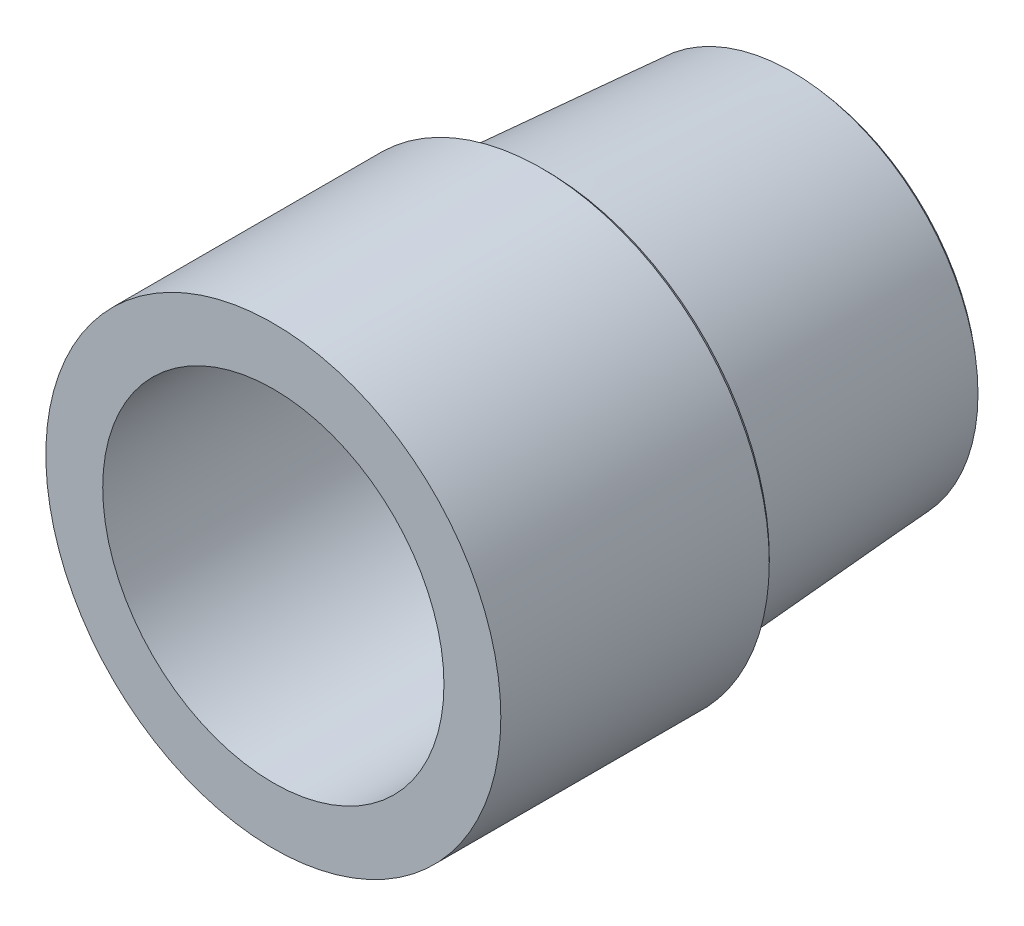
ISO-10303-21;
HEADER;
FILE_DESCRIPTION(('STEP AP214'),'2;1');
FILE_NAME('part.step','',(''),(''),'','','');
FILE_SCHEMA(('AUTOMOTIVE_DESIGN { 1 0 10303 214 1 1 1 1 }'));
ENDSEC;
DATA;
#1=APPLICATION_CONTEXT('core data for automotive mechanical design processes');
#2=APPLICATION_PROTOCOL_DEFINITION('international standard','automotive_design',2000,#1);
#3=PRODUCT_CONTEXT('',#1,'mechanical');
#4=PRODUCT('Part','Part','',(#3));
#5=PRODUCT_RELATED_PRODUCT_CATEGORY('part','',(#4));
#6=PRODUCT_DEFINITION_FORMATION('','',#4);
#7=PRODUCT_DEFINITION_CONTEXT('part definition',#1,'design');
#8=PRODUCT_DEFINITION('design','',#6,#7);
#9=PRODUCT_DEFINITION_SHAPE('','',#8);
#10=(LENGTH_UNIT() NAMED_UNIT(*) SI_UNIT(.MILLI.,.METRE.));
#11=(NAMED_UNIT(*) PLANE_ANGLE_UNIT() SI_UNIT($,.RADIAN.));
#12=(NAMED_UNIT(*) SI_UNIT($,.STERADIAN.) SOLID_ANGLE_UNIT());
#13=UNCERTAINTY_MEASURE_WITH_UNIT(LENGTH_MEASURE(1.E-05),#10,'distance_accuracy_value','');
#14=(GEOMETRIC_REPRESENTATION_CONTEXT(3) GLOBAL_UNCERTAINTY_ASSIGNED_CONTEXT((#13)) GLOBAL_UNIT_ASSIGNED_CONTEXT((#10,
#11,#12)) REPRESENTATION_CONTEXT('',''));
#15=CARTESIAN_POINT('',(0.,0.,0.));
#16=DIRECTION('',(0.,0.,1.));
#17=DIRECTION('',(1.,0.,0.));
#18=AXIS2_PLACEMENT_3D('',#15,#16,#17);
#19=CARTESIAN_POINT('',(0.,0.,12.));
#20=DIRECTION('',(0.,0.,-1.));
#21=DIRECTION('',(-1.,0.,0.));
#22=AXIS2_PLACEMENT_3D('',#19,#20,#21);
#23=CYLINDRICAL_SURFACE('',#22,7.5);
#24=CARTESIAN_POINT('',(0.,0.,12.));
#25=DIRECTION('',(0.,0.,1.));
#26=DIRECTION('',(1.,0.,0.));
#27=AXIS2_PLACEMENT_3D('',#24,#25,#26);
#28=CIRCLE('',#27,7.5);
#29=CARTESIAN_POINT('',(7.5,0.,12.));
#30=VERTEX_POINT('',#29);
#31=EDGE_CURVE('E133',#30,#30,#28,.T.);
#32=ORIENTED_EDGE('',*,*,#31,.T.);
#33=EDGE_LOOP('',(#32));
#34=FACE_BOUND('',#33,.T.);
#35=CARTESIAN_POINT('',(0.,0.,1.));
#36=DIRECTION('',(0.,0.,-1.));
#37=DIRECTION('',(-1.,0.,0.));
#38=AXIS2_PLACEMENT_3D('',#35,#36,#37);
#39=CIRCLE('',#38,7.5);
#40=CARTESIAN_POINT('',(-7.5,0.,1.));
#41=VERTEX_POINT('',#40);
#42=EDGE_CURVE('E104',#41,#41,#39,.T.);
#43=ORIENTED_EDGE('',*,*,#42,.T.);
#44=EDGE_LOOP('',(#43));
#45=FACE_BOUND('',#44,.T.);
#46=ADVANCED_FACE('F40',(#34,#45),#23,.F.);
#47=CARTESIAN_POINT('',(0.,0.,12.));
#48=DIRECTION('',(0.,0.,1.));
#49=DIRECTION('',(1.,0.,0.));
#50=AXIS2_PLACEMENT_3D('',#47,#48,#49);
#51=PLANE('',#50);
#52=CARTESIAN_POINT('',(0.,0.,12.));
#53=DIRECTION('',(0.,0.,1.));
#54=DIRECTION('',(1.,0.,0.));
#55=AXIS2_PLACEMENT_3D('',#52,#53,#54);
#56=CIRCLE('',#55,10.);
#57=CARTESIAN_POINT('',(10.,0.,12.));
#58=VERTEX_POINT('',#57);
#59=EDGE_CURVE('E137',#58,#58,#56,.T.);
#60=ORIENTED_EDGE('',*,*,#59,.T.);
#61=EDGE_LOOP('',(#60));
#62=FACE_BOUND('',#61,.T.);
#63=ORIENTED_EDGE('',*,*,#31,.F.);
#64=EDGE_LOOP('',(#63));
#65=FACE_BOUND('',#64,.T.);
#66=ADVANCED_FACE('F228',(#62,#65),#51,.T.);
#67=CARTESIAN_POINT('',(0.,0.,0.));
#68=DIRECTION('',(0.,0.,1.));
#69=DIRECTION('',(1.,0.,0.));
#70=AXIS2_PLACEMENT_3D('',#67,#68,#69);
#71=PLANE('',#70);
#72=CARTESIAN_POINT('',(0.,0.,0.));
#73=DIRECTION('',(0.,0.,1.));
#74=DIRECTION('',(1.,0.,0.));
#75=AXIS2_PLACEMENT_3D('',#72,#73,#74);
#76=CIRCLE('',#75,9.8);
#77=CARTESIAN_POINT('',(9.8,0.,0.));
#78=VERTEX_POINT('',#77);
#79=EDGE_CURVE('E11',#78,#78,#76,.F.);
#80=ORIENTED_EDGE('',*,*,#79,.T.);
#81=EDGE_LOOP('',(#80));
#82=FACE_BOUND('',#81,.T.);
#83=CARTESIAN_POINT('',(0.,0.,0.));
#84=DIRECTION('',(0.,0.,1.));
#85=DIRECTION('',(1.,0.,0.));
#86=AXIS2_PLACEMENT_3D('',#83,#84,#85);
#87=CIRCLE('',#86,8.93007318805649);
#88=CARTESIAN_POINT('',(8.93007318805649,0.,0.));
#89=VERTEX_POINT('',#88);
#90=EDGE_CURVE('E141',#89,#89,#87,.F.);
#91=ORIENTED_EDGE('',*,*,#90,.F.);
#92=EDGE_LOOP('',(#91));
#93=FACE_BOUND('',#92,.T.);
#94=ADVANCED_FACE('F234',(#82,#93),#71,.F.);
#95=CARTESIAN_POINT('',(0.,0.,12.));
#96=DIRECTION('',(0.,0.,-1.));
#97=DIRECTION('',(-1.,0.,0.));
#98=AXIS2_PLACEMENT_3D('',#95,#96,#97);
#99=CYLINDRICAL_SURFACE('',#98,10.);
#100=CARTESIAN_POINT('',(0.,0.,0.200000000000001));
#101=DIRECTION('',(0.,0.,1.));
#102=DIRECTION('',(1.,0.,0.));
#103=AXIS2_PLACEMENT_3D('',#100,#101,#102);
#104=CIRCLE('',#103,10.);
#105=CARTESIAN_POINT('',(10.,0.,0.200000000000001));
#106=VERTEX_POINT('',#105);
#107=EDGE_CURVE('E51',#106,#106,#104,.T.);
#108=ORIENTED_EDGE('',*,*,#107,.T.);
#109=EDGE_LOOP('',(#108));
#110=FACE_BOUND('',#109,.T.);
#111=ORIENTED_EDGE('',*,*,#59,.F.);
#112=EDGE_LOOP('',(#111));
#113=FACE_BOUND('',#112,.T.);
#114=ADVANCED_FACE('F244',(#110,#113),#99,.T.);
#115=CARTESIAN_POINT('',(0.,0.,1.));
#116=DIRECTION('',(0.,0.,-1.));
#117=DIRECTION('',(-1.,0.,0.));
#118=AXIS2_PLACEMENT_3D('',#115,#116,#117);
#119=PLANE('',#118);
#120=ORIENTED_EDGE('',*,*,#42,.F.);
#121=EDGE_LOOP('',(#120));
#122=FACE_BOUND('',#121,.T.);
#123=ADVANCED_FACE('F248',(#122),#119,.F.);
#124=CARTESIAN_POINT('',(0.,0.,1.));
#125=DIRECTION('',(0.,0.,1.));
#126=DIRECTION('',(-1.,0.,0.));
#127=AXIS2_PLACEMENT_3D('',#124,#125,#126);
#128=CONICAL_SURFACE('',#127,9.,0.0698131700797733);
#129=CARTESIAN_POINT('',(0.,0.,-10.800487189948));
#130=DIRECTION('',(0.,0.,1.));
#131=DIRECTION('',(1.,0.,0.));
#132=AXIS2_PLACEMENT_3D('',#129,#130,#131);
#133=CIRCLE('',#132,8.1748295514267);
#134=CARTESIAN_POINT('',(8.1748295514267,0.,-10.800487189948));
#135=VERTEX_POINT('',#134);
#136=EDGE_CURVE('E176',#135,#135,#133,.T.);
#137=ORIENTED_EDGE('',*,*,#136,.T.);
#138=EDGE_LOOP('',(#137));
#139=FACE_BOUND('',#138,.T.);
#140=ORIENTED_EDGE('',*,*,#90,.T.);
#141=EDGE_LOOP('',(#140));
#142=FACE_BOUND('',#141,.T.);
#143=ADVANCED_FACE('F239',(#139,#142),#128,.T.);
#144=CARTESIAN_POINT('',(0.,0.,-11.));
#145=DIRECTION('',(0.,0.,-1.));
#146=DIRECTION('',(-1.,0.,0.));
#147=AXIS2_PLACEMENT_3D('',#144,#145,#146);
#148=PLANE('',#147);
#149=DIRECTION('',(0.,-1.,0.));
#150=VECTOR('',#149,1.);
#151=CARTESIAN_POINT('',(-2.2,-7.,-11.));
#152=LINE('',#151,#150);
#153=CARTESIAN_POINT('',(-2.2,7.2,-11.));
#154=VERTEX_POINT('',#153);
#155=CARTESIAN_POINT('',(-2.2,-7.2,-11.));
#156=VERTEX_POINT('',#155);
#157=EDGE_CURVE('E156',#154,#156,#152,.T.);
#158=ORIENTED_EDGE('',*,*,#157,.T.);
#159=DIRECTION('',(1.,0.,0.));
#160=VECTOR('',#159,1.);
#161=CARTESIAN_POINT('',(2.,-7.2,-11.));
#162=LINE('',#161,#160);
#163=CARTESIAN_POINT('',(2.2,-7.2,-11.));
#164=VERTEX_POINT('',#163);
#165=EDGE_CURVE('E165',#156,#164,#162,.T.);
#166=ORIENTED_EDGE('',*,*,#165,.T.);
#167=DIRECTION('',(0.,1.,0.));
#168=VECTOR('',#167,1.);
#169=CARTESIAN_POINT('',(2.2,7.,-11.));
#170=LINE('',#169,#168);
#171=CARTESIAN_POINT('',(2.2,7.2,-11.));
#172=VERTEX_POINT('',#171);
#173=EDGE_CURVE('E162',#164,#172,#170,.T.);
#174=ORIENTED_EDGE('',*,*,#173,.T.);
#175=DIRECTION('',(-1.,0.,0.));
#176=VECTOR('',#175,1.);
#177=CARTESIAN_POINT('',(-2.,7.2,-11.));
#178=LINE('',#177,#176);
#179=EDGE_CURVE('E159',#172,#154,#178,.T.);
#180=ORIENTED_EDGE('',*,*,#179,.T.);
#181=EDGE_LOOP('',(#158,#166,#174,#180));
#182=FACE_BOUND('',#181,.T.);
#183=CARTESIAN_POINT('',(0.,0.,-11.));
#184=DIRECTION('',(0.,0.,-1.));
#185=DIRECTION('',(-1.,0.,0.));
#186=AXIS2_PLACEMENT_3D('',#183,#184,#185);
#187=CIRCLE('',#186,7.94531631790704);
#188=CARTESIAN_POINT('',(7.94531631790704,0.,-11.));
#189=VERTEX_POINT('',#188);
#190=EDGE_CURVE('E152',#189,#189,#187,.T.);
#191=ORIENTED_EDGE('',*,*,#190,.T.);
#192=EDGE_LOOP('',(#191));
#193=FACE_BOUND('',#192,.T.);
#194=ADVANCED_FACE('F205',(#182,#193),#148,.T.);
#195=CARTESIAN_POINT('',(2.,7.,-11.));
#196=DIRECTION('',(0.996194698091746,0.,0.0871557427476584));
#197=DIRECTION('',(0.0871557427476584,0.,-0.996194698091746));
#198=AXIS2_PLACEMENT_3D('',#195,#196,#197);
#199=PLANE('',#198);
#200=DIRECTION('',(0.0868265938642478,0.0868265938642478,-0.992432509138967));
#201=VECTOR('',#200,1.);
#202=CARTESIAN_POINT('',(2.,7.,-11.));
#203=LINE('',#202,#201);
#204=CARTESIAN_POINT('',(1.30009069179261,6.30009069179261,-3.));
#205=VERTEX_POINT('',#204);
#206=CARTESIAN_POINT('',(1.98082464074058,6.98082464074058,-10.7808246407406));
#207=VERTEX_POINT('',#206);
#208=EDGE_CURVE('E96',#205,#207,#203,.T.);
#209=ORIENTED_EDGE('',*,*,#208,.T.);
#210=DIRECTION('',(0.,-1.,0.));
#211=VECTOR('',#210,1.);
#212=CARTESIAN_POINT('',(1.98082464074058,-7.,-10.7808246407406));
#213=LINE('',#212,#211);
#214=CARTESIAN_POINT('',(1.98082464074058,-6.98082464074058,-10.7808246407406));
#215=VERTEX_POINT('',#214);
#216=EDGE_CURVE('E169',#207,#215,#213,.T.);
#217=ORIENTED_EDGE('',*,*,#216,.T.);
#218=DIRECTION('',(0.0868265938642478,-0.0868265938642478,-0.992432509138967));
#219=VECTOR('',#218,1.);
#220=CARTESIAN_POINT('',(1.89445599637106,-6.89445599637106,-9.7936265182784));
#221=LINE('',#220,#219);
#222=CARTESIAN_POINT('',(1.30009069179261,-6.30009069179261,-3.));
#223=VERTEX_POINT('',#222);
#224=EDGE_CURVE('E111',#223,#215,#221,.T.);
#225=ORIENTED_EDGE('',*,*,#224,.F.);
#226=DIRECTION('',(0.,-1.,0.));
#227=VECTOR('',#226,1.);
#228=CARTESIAN_POINT('',(1.30009069179261,0.,-3.));
#229=LINE('',#228,#227);
#230=EDGE_CURVE('E108',#205,#223,#229,.T.);
#231=ORIENTED_EDGE('',*,*,#230,.F.);
#232=EDGE_LOOP('',(#209,#217,#225,#231));
#233=FACE_BOUND('',#232,.T.);
#234=ADVANCED_FACE('F109',(#233),#199,.F.);
#235=CARTESIAN_POINT('',(2.,7.,-11.));
#236=DIRECTION('',(0.,0.996194698091746,0.0871557427476584));
#237=DIRECTION('',(0.,-0.0871557427476584,0.996194698091746));
#238=AXIS2_PLACEMENT_3D('',#235,#236,#237);
#239=PLANE('',#238);
#240=DIRECTION('',(-0.0868265938642478,0.0868265938642478,-0.992432509138967));
#241=VECTOR('',#240,1.);
#242=CARTESIAN_POINT('',(-2.,7.,-11.));
#243=LINE('',#242,#241);
#244=CARTESIAN_POINT('',(-1.30009069179261,6.30009069179261,-3.));
#245=VERTEX_POINT('',#244);
#246=CARTESIAN_POINT('',(-1.98082464074058,6.98082464074058,-10.7808246407406));
#247=VERTEX_POINT('',#246);
#248=EDGE_CURVE('E105',#245,#247,#243,.T.);
#249=ORIENTED_EDGE('',*,*,#248,.T.);
#250=DIRECTION('',(1.,0.,0.));
#251=VECTOR('',#250,1.);
#252=CARTESIAN_POINT('',(2.,6.98082464074058,-10.7808246407406));
#253=LINE('',#252,#251);
#254=EDGE_CURVE('E66',#247,#207,#253,.T.);
#255=ORIENTED_EDGE('',*,*,#254,.T.);
#256=ORIENTED_EDGE('',*,*,#208,.F.);
#257=DIRECTION('',(1.,0.,0.));
#258=VECTOR('',#257,1.);
#259=CARTESIAN_POINT('',(0.,6.30009069179261,-3.));
#260=LINE('',#259,#258);
#261=EDGE_CURVE('E100',#245,#205,#260,.T.);
#262=ORIENTED_EDGE('',*,*,#261,.F.);
#263=EDGE_LOOP('',(#249,#255,#256,#262));
#264=FACE_BOUND('',#263,.T.);
#265=ADVANCED_FACE('F98',(#264),#239,.F.);
#266=CARTESIAN_POINT('',(-2.,7.,-11.));
#267=DIRECTION('',(-0.996194698091746,0.,0.0871557427476584));
#268=DIRECTION('',(0.0871557427476584,0.,0.996194698091746));
#269=AXIS2_PLACEMENT_3D('',#266,#267,#268);
#270=PLANE('',#269);
#271=DIRECTION('',(-0.0868265938642478,-0.0868265938642478,-0.992432509138967));
#272=VECTOR('',#271,1.);
#273=CARTESIAN_POINT('',(-1.96984457039173,-6.96984457039173,-10.6553218623653));
#274=LINE('',#273,#272);
#275=CARTESIAN_POINT('',(-1.30009069179261,-6.30009069179261,-3.));
#276=VERTEX_POINT('',#275);
#277=CARTESIAN_POINT('',(-1.98082464074058,-6.98082464074058,-10.7808246407406));
#278=VERTEX_POINT('',#277);
#279=EDGE_CURVE('E126',#276,#278,#274,.T.);
#280=ORIENTED_EDGE('',*,*,#279,.T.);
#281=DIRECTION('',(0.,1.,0.));
#282=VECTOR('',#281,1.);
#283=CARTESIAN_POINT('',(-1.98082464074058,7.,-10.7808246407406));
#284=LINE('',#283,#282);
#285=EDGE_CURVE('E59',#278,#247,#284,.T.);
#286=ORIENTED_EDGE('',*,*,#285,.T.);
#287=ORIENTED_EDGE('',*,*,#248,.F.);
#288=DIRECTION('',(0.,1.,0.));
#289=VECTOR('',#288,1.);
#290=CARTESIAN_POINT('',(-1.30009069179261,0.,-3.));
#291=LINE('',#290,#289);
#292=EDGE_CURVE('E121',#276,#245,#291,.T.);
#293=ORIENTED_EDGE('',*,*,#292,.F.);
#294=EDGE_LOOP('',(#280,#286,#287,#293));
#295=FACE_BOUND('',#294,.T.);
#296=ADVANCED_FACE('F215',(#295),#270,.F.);
#297=CARTESIAN_POINT('',(2.,-7.,-11.));
#298=DIRECTION('',(0.,-0.996194698091746,0.0871557427476584));
#299=DIRECTION('',(0.,-0.0871557427476584,-0.996194698091746));
#300=AXIS2_PLACEMENT_3D('',#297,#298,#299);
#301=PLANE('',#300);
#302=ORIENTED_EDGE('',*,*,#224,.T.);
#303=DIRECTION('',(-1.,0.,0.));
#304=VECTOR('',#303,1.);
#305=CARTESIAN_POINT('',(-2.,-6.98082464074058,-10.7808246407406));
#306=LINE('',#305,#304);
#307=EDGE_CURVE('E148',#215,#278,#306,.T.);
#308=ORIENTED_EDGE('',*,*,#307,.T.);
#309=ORIENTED_EDGE('',*,*,#279,.F.);
#310=DIRECTION('',(-1.,0.,0.));
#311=VECTOR('',#310,1.);
#312=CARTESIAN_POINT('',(0.,-6.30009069179261,-3.));
#313=LINE('',#312,#311);
#314=EDGE_CURVE('E116',#223,#276,#313,.T.);
#315=ORIENTED_EDGE('',*,*,#314,.F.);
#316=EDGE_LOOP('',(#302,#308,#309,#315));
#317=FACE_BOUND('',#316,.T.);
#318=ADVANCED_FACE('F214',(#317),#301,.F.);
#319=CARTESIAN_POINT('',(0.,0.,-3.));
#320=DIRECTION('',(0.,0.,-1.));
#321=DIRECTION('',(-1.,0.,0.));
#322=AXIS2_PLACEMENT_3D('',#319,#320,#321);
#323=PLANE('',#322);
#324=ORIENTED_EDGE('',*,*,#230,.T.);
#325=ORIENTED_EDGE('',*,*,#314,.T.);
#326=ORIENTED_EDGE('',*,*,#292,.T.);
#327=ORIENTED_EDGE('',*,*,#261,.T.);
#328=EDGE_LOOP('',(#324,#325,#326,#327));
#329=FACE_BOUND('',#328,.T.);
#330=ADVANCED_FACE('F119',(#329),#323,.T.);
#331=CARTESIAN_POINT('',(2.,6.98082464074058,-10.7808246407406));
#332=DIRECTION('',(0.,-0.707106781186546,-0.707106781186549));
#333=DIRECTION('',(-1.,0.,0.));
#334=AXIS2_PLACEMENT_3D('',#331,#332,#333);
#335=PLANE('',#334);
#336=DIRECTION('',(0.577350269189625,-0.577350269189627,0.577350269189625));
#337=VECTOR('',#336,1.);
#338=CARTESIAN_POINT('',(-0.653883093827057,5.65388309382705,-9.45388309382705));
#339=LINE('',#338,#337);
#340=EDGE_CURVE('E188',#154,#247,#339,.T.);
#341=ORIENTED_EDGE('',*,*,#340,.F.);
#342=ORIENTED_EDGE('',*,*,#179,.F.);
#343=DIRECTION('',(-0.577350269189625,-0.577350269189627,0.577350269189625));
#344=VECTOR('',#343,1.);
#345=CARTESIAN_POINT('',(1.98721642716039,6.98721642716039,-10.7872164271604));
#346=LINE('',#345,#344);
#347=EDGE_CURVE('E45',#207,#172,#346,.F.);
#348=ORIENTED_EDGE('',*,*,#347,.F.);
#349=ORIENTED_EDGE('',*,*,#254,.F.);
#350=EDGE_LOOP('',(#341,#342,#348,#349));
#351=FACE_BOUND('',#350,.T.);
#352=ADVANCED_FACE('F203',(#351),#335,.T.);
#353=CARTESIAN_POINT('',(1.98082464074058,7.,-10.7808246407406));
#354=DIRECTION('',(-0.707106781186548,0.,-0.707106781186548));
#355=DIRECTION('',(0.,1.,0.));
#356=AXIS2_PLACEMENT_3D('',#353,#354,#355);
#357=PLANE('',#356);
#358=ORIENTED_EDGE('',*,*,#347,.T.);
#359=ORIENTED_EDGE('',*,*,#173,.F.);
#360=DIRECTION('',(-0.577350269189625,0.577350269189627,0.577350269189625));
#361=VECTOR('',#360,1.);
#362=CARTESIAN_POINT('',(1.98721642716039,-6.98721642716039,-10.7872164271604));
#363=LINE('',#362,#361);
#364=EDGE_CURVE('E186',#215,#164,#363,.F.);
#365=ORIENTED_EDGE('',*,*,#364,.F.);
#366=ORIENTED_EDGE('',*,*,#216,.F.);
#367=EDGE_LOOP('',(#358,#359,#365,#366));
#368=FACE_BOUND('',#367,.T.);
#369=ADVANCED_FACE('F199',(#368),#357,.T.);
#370=CARTESIAN_POINT('',(-1.98082464074058,7.,-10.7808246407406));
#371=DIRECTION('',(0.707106781186548,0.,-0.707106781186548));
#372=DIRECTION('',(0.,-1.,0.));
#373=AXIS2_PLACEMENT_3D('',#370,#371,#372);
#374=PLANE('',#373);
#375=ORIENTED_EDGE('',*,*,#340,.T.);
#376=ORIENTED_EDGE('',*,*,#285,.F.);
#377=DIRECTION('',(-0.577350269189625,-0.577350269189627,-0.577350269189625));
#378=VECTOR('',#377,1.);
#379=CARTESIAN_POINT('',(-0.653883093827056,-5.65388309382705,-9.45388309382705));
#380=LINE('',#379,#378);
#381=EDGE_CURVE('E183',#156,#278,#380,.F.);
#382=ORIENTED_EDGE('',*,*,#381,.F.);
#383=ORIENTED_EDGE('',*,*,#157,.F.);
#384=EDGE_LOOP('',(#375,#376,#382,#383));
#385=FACE_BOUND('',#384,.T.);
#386=ADVANCED_FACE('F212',(#385),#374,.T.);
#387=CARTESIAN_POINT('',(2.,-6.98082464074058,-10.7808246407406));
#388=DIRECTION('',(0.,0.707106781186546,-0.707106781186549));
#389=DIRECTION('',(1.,0.,0.));
#390=AXIS2_PLACEMENT_3D('',#387,#388,#389);
#391=PLANE('',#390);
#392=ORIENTED_EDGE('',*,*,#364,.T.);
#393=ORIENTED_EDGE('',*,*,#165,.F.);
#394=ORIENTED_EDGE('',*,*,#381,.T.);
#395=ORIENTED_EDGE('',*,*,#307,.F.);
#396=EDGE_LOOP('',(#392,#393,#394,#395));
#397=FACE_BOUND('',#396,.T.);
#398=ADVANCED_FACE('F210',(#397),#391,.T.);
#399=CARTESIAN_POINT('',(0.,0.,-11.));
#400=DIRECTION('',(0.,0.,1.));
#401=DIRECTION('',(1.,0.,0.));
#402=AXIS2_PLACEMENT_3D('',#399,#400,#401);
#403=CONICAL_SURFACE('',#402,7.94531631790704,0.855211333477208);
#404=CARTESIAN_POINT('',(8.1748295514267,0.,-10.800487189948));
#405=CARTESIAN_POINT('',(8.17243878857754,0.,-10.8025654483861));
#406=CARTESIAN_POINT('',(8.17004802572837,0.,-10.8046437068241));
#407=CARTESIAN_POINT('',(8.16526650003005,0.,-10.8088002237002));
#408=CARTESIAN_POINT('',(8.16287573718088,0.,-10.8108784821382));
#409=CARTESIAN_POINT('',(8.15809421148256,0.,-10.8150349990143));
#410=CARTESIAN_POINT('',(8.15570344863339,0.,-10.8171132574524));
#411=CARTESIAN_POINT('',(8.15092192293507,0.,-10.8212697743284));
#412=CARTESIAN_POINT('',(8.14853116008591,0.,-10.8233480327665));
#413=CARTESIAN_POINT('',(8.14374963438758,0.,-10.8275045496426));
#414=CARTESIAN_POINT('',(8.14135887153842,0.,-10.8295828080806));
#415=CARTESIAN_POINT('',(8.13657734584009,0.,-10.8337393249567));
#416=CARTESIAN_POINT('',(8.13418658299093,0.,-10.8358175833947));
#417=CARTESIAN_POINT('',(8.1294050572926,0.,-10.8399741002708));
#418=CARTESIAN_POINT('',(8.12701429444344,0.,-10.8420523587089));
#419=CARTESIAN_POINT('',(8.12223276874511,0.,-10.8462088755849));
#420=CARTESIAN_POINT('',(8.11984200589595,0.,-10.848287134023));
#421=CARTESIAN_POINT('',(8.11506048019762,0.,-10.8524436508991));
#422=CARTESIAN_POINT('',(8.11266971734846,0.,-10.8545219093371));
#423=CARTESIAN_POINT('',(8.10788819165013,0.,-10.8586784262132));
#424=CARTESIAN_POINT('',(8.10549742880097,0.,-10.8607566846512));
#425=CARTESIAN_POINT('',(8.10071590310264,0.,-10.8649132015273));
#426=CARTESIAN_POINT('',(8.09832514025348,0.,-10.8669914599654));
#427=CARTESIAN_POINT('',(8.09354361455515,0.,-10.8711479768414));
#428=CARTESIAN_POINT('',(8.09115285170599,0.,-10.8732262352795));
#429=CARTESIAN_POINT('',(8.08637132600766,0.,-10.8773827521556));
#430=CARTESIAN_POINT('',(8.0839805631585,0.,-10.8794610105936));
#431=CARTESIAN_POINT('',(8.07919903746017,0.,-10.8836175274697));
#432=CARTESIAN_POINT('',(8.07680827461101,0.,-10.8856957859077));
#433=CARTESIAN_POINT('',(8.07202674891268,0.,-10.8898523027838));
#434=CARTESIAN_POINT('',(8.06963598606352,0.,-10.8919305612219));
#435=CARTESIAN_POINT('',(8.0648544603652,0.,-10.8960870780979));
#436=CARTESIAN_POINT('',(8.06246369751603,0.,-10.898165336536));
#437=CARTESIAN_POINT('',(8.05768217181771,0.,-10.9023218534121));
#438=CARTESIAN_POINT('',(8.05529140896854,0.,-10.9044001118501));
#439=CARTESIAN_POINT('',(8.05050988327022,0.,-10.9085566287262));
#440=CARTESIAN_POINT('',(8.04811912042105,0.,-10.9106348871642));
#441=CARTESIAN_POINT('',(8.04333759472273,0.,-10.9147914040403));
#442=CARTESIAN_POINT('',(8.04094683187357,0.,-10.9168696624783));
#443=CARTESIAN_POINT('',(8.03616530617524,0.,-10.9210261793544));
#444=CARTESIAN_POINT('',(8.03377454332607,0.,-10.9231044377925));
#445=CARTESIAN_POINT('',(8.02899301762775,0.,-10.9272609546686));
#446=CARTESIAN_POINT('',(8.02660225477859,0.,-10.9293392131066));
#447=CARTESIAN_POINT('',(8.02182072908026,0.,-10.9334957299827));
#448=CARTESIAN_POINT('',(8.0194299662311,0.,-10.9355739884207));
#449=CARTESIAN_POINT('',(8.01464844053277,0.,-10.9397305052968));
#450=CARTESIAN_POINT('',(8.01225767768361,0.,-10.9418087637348));
#451=CARTESIAN_POINT('',(8.00747615198528,0.,-10.9459652806109));
#452=CARTESIAN_POINT('',(8.00508538913612,0.,-10.948043539049));
#453=CARTESIAN_POINT('',(8.00030386343779,0.,-10.952200055925));
#454=CARTESIAN_POINT('',(7.99791310058863,0.,-10.9542783143631));
#455=CARTESIAN_POINT('',(7.9931315748903,0.,-10.9584348312392));
#456=CARTESIAN_POINT('',(7.99074081204114,0.,-10.9605130896772));
#457=CARTESIAN_POINT('',(7.98595928634281,0.,-10.9646696065533));
#458=CARTESIAN_POINT('',(7.98356852349365,0.,-10.9667478649913));
#459=CARTESIAN_POINT('',(7.97878699779532,0.,-10.9709043818674));
#460=CARTESIAN_POINT('',(7.97639623494616,0.,-10.9729826403055));
#461=CARTESIAN_POINT('',(7.97161470924783,0.,-10.9771391571815));
#462=CARTESIAN_POINT('',(7.96922394639867,0.,-10.9792174156196));
#463=CARTESIAN_POINT('',(7.96444242070034,0.,-10.9833739324957));
#464=CARTESIAN_POINT('',(7.96205165785118,0.,-10.9854521909337));
#465=CARTESIAN_POINT('',(7.95727013215285,0.,-10.9896087078098));
#466=CARTESIAN_POINT('',(7.95487936930369,0.,-10.9916869662478));
#467=CARTESIAN_POINT('',(7.95009784360537,0.,-10.9958434831239));
#468=CARTESIAN_POINT('',(7.9477070807562,0.,-10.997921741562));
#469=CARTESIAN_POINT('',(7.94531631790704,0.,-11.));
#470=B_SPLINE_CURVE_WITH_KNOTS('',3,(#404,#405,#406,#407,#408,#409,#410,#411,#412,#413,#414,
#415,#416,#417,#418,#419,#420,#421,#422,#423,#424,#425,#426,#427,#428,#429,#430,#431,#432,#433,
#434,#435,#436,#437,#438,#439,#440,#441,#442,#443,#444,#445,#446,#447,#448,#449,#450,#451,#452,
#453,#454,#455,#456,#457,#458,#459,#460,#461,#462,#463,#464,#465,#466,#467,#468,#469),
.UNSPECIFIED.,.F.,.F.,(4,2,2,2,2,2,2,2,2,2,2,2,2,2,2,2,2,2,2,2,2,2,2,2,2,2,2,2,2,2,2,2,4),(0.,
0.00950337551746839,0.0190067510349392,0.0285101265524089,0.0380135020698798,0.0475168775873506,
0.0570202531048203,0.0665236286222912,0.076027004139762,0.0855303796572317,0.0950337551747026,
0.104537130692173,0.114040506209643,0.123543881727114,0.133047257244585,0.142550632762054,
0.152054008279524,0.161557383796995,0.171060759314465,0.180564134831935,0.190067510349406,
0.199570885866876,0.209074261384347,0.218577636901818,0.228081012419287,0.237584387936758,
0.247087763454229,0.256591138971699,0.266094514489169,0.27559789000664,0.28510126552411,
0.29460464104158,0.304108016559051),.UNSPECIFIED.);
#471=EDGE_CURVE('BSEAM257',#135,#189,#470,.T.);
#472=ORIENTED_EDGE('',*,*,#136,.F.);
#473=ORIENTED_EDGE('',*,*,#190,.F.);
#474=ORIENTED_EDGE('',*,*,#471,.T.);
#475=ORIENTED_EDGE('',*,*,#471,.F.);
#476=EDGE_LOOP('',(#472,#474,#473,#475));
#477=FACE_BOUND('',#476,.T.);
#478=ADVANCED_FACE('F257',(#477),#403,.T.);
#479=CARTESIAN_POINT('',(0.,0.,0.200000000000001));
#480=DIRECTION('',(0.,0.,1.));
#481=DIRECTION('',(1.,0.,0.));
#482=AXIS2_PLACEMENT_3D('',#479,#480,#481);
#483=CONICAL_SURFACE('',#482,10.,0.785398163397448);
#484=ORIENTED_EDGE('',*,*,#79,.F.);
#485=EDGE_LOOP('',(#484));
#486=FACE_BOUND('',#485,.T.);
#487=ORIENTED_EDGE('',*,*,#107,.F.);
#488=EDGE_LOOP('',(#487));
#489=FACE_BOUND('',#488,.T.);
#490=ADVANCED_FACE('F43',(#486,#489),#483,.T.);
#491=CLOSED_SHELL('',(#46,#66,#94,#114,#123,#143,#194,#234,#265,#296,#318,#330,#352,#369,#386,
#398,#478,#490));
#492=MANIFOLD_SOLID_BREP('B2',#491);
#493=ADVANCED_BREP_SHAPE_REPRESENTATION('',(#18,#492),#14);
#494=SHAPE_DEFINITION_REPRESENTATION(#9,#493);
ENDSEC;
END-ISO-10303-21;
